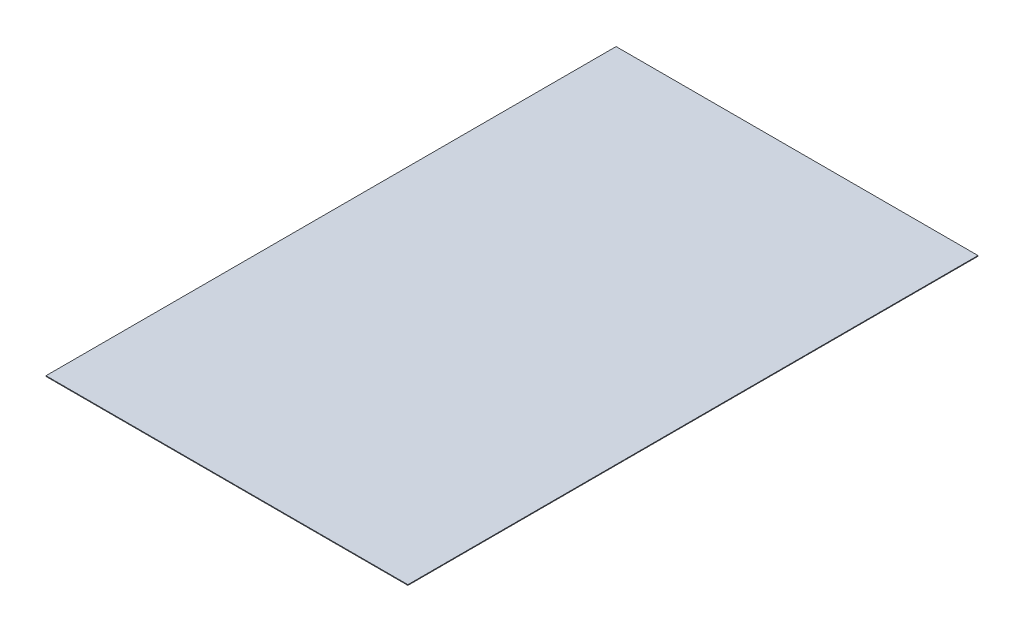
ISO-10303-21;
HEADER;
FILE_DESCRIPTION(('STEP AP214'),'2;1');
FILE_NAME('part.step','',(''),(''),'','','');
FILE_SCHEMA(('AUTOMOTIVE_DESIGN { 1 0 10303 214 1 1 1 1 }'));
ENDSEC;
DATA;
#1=APPLICATION_CONTEXT('core data for automotive mechanical design processes');
#2=APPLICATION_PROTOCOL_DEFINITION('international standard','automotive_design',2000,#1);
#3=PRODUCT_CONTEXT('',#1,'mechanical');
#4=PRODUCT('Part','Part','',(#3));
#5=PRODUCT_RELATED_PRODUCT_CATEGORY('part','',(#4));
#6=PRODUCT_DEFINITION_FORMATION('','',#4);
#7=PRODUCT_DEFINITION_CONTEXT('part definition',#1,'design');
#8=PRODUCT_DEFINITION('design','',#6,#7);
#9=PRODUCT_DEFINITION_SHAPE('','',#8);
#10=(LENGTH_UNIT() NAMED_UNIT(*) SI_UNIT(.MILLI.,.METRE.));
#11=(NAMED_UNIT(*) PLANE_ANGLE_UNIT() SI_UNIT($,.RADIAN.));
#12=(NAMED_UNIT(*) SI_UNIT($,.STERADIAN.) SOLID_ANGLE_UNIT());
#13=UNCERTAINTY_MEASURE_WITH_UNIT(LENGTH_MEASURE(1.E-05),#10,'distance_accuracy_value','');
#14=(GEOMETRIC_REPRESENTATION_CONTEXT(3) GLOBAL_UNCERTAINTY_ASSIGNED_CONTEXT((#13)) GLOBAL_UNIT_ASSIGNED_CONTEXT((#10,
#11,#12)) REPRESENTATION_CONTEXT('',''));
#15=CARTESIAN_POINT('',(0.,0.,0.));
#16=DIRECTION('',(0.,0.,1.));
#17=DIRECTION('',(1.,0.,0.));
#18=AXIS2_PLACEMENT_3D('',#15,#16,#17);
#19=CARTESIAN_POINT('',(0.,10.,0.));
#20=DIRECTION('',(1.,0.,0.));
#21=DIRECTION('',(0.,0.,-1.));
#22=AXIS2_PLACEMENT_3D('',#19,#20,#21);
#23=PLANE('',#22);
#24=DIRECTION('',(0.,0.,1.));
#25=VECTOR('',#24,1.);
#26=CARTESIAN_POINT('',(0.,0.,0.));
#27=LINE('',#26,#25);
#28=CARTESIAN_POINT('',(0.,0.,0.));
#29=VERTEX_POINT('',#28);
#30=CARTESIAN_POINT('',(1.02625401768548E-12,0.,8380.));
#31=VERTEX_POINT('',#30);
#32=EDGE_CURVE('E99',#29,#31,#27,.T.);
#33=ORIENTED_EDGE('',*,*,#32,.T.);
#34=DIRECTION('',(0.,-1.,0.));
#35=VECTOR('',#34,1.);
#36=CARTESIAN_POINT('',(1.02625401768548E-12,10.,8380.));
#37=LINE('',#36,#35);
#38=CARTESIAN_POINT('',(1.02625401768548E-12,10.,8380.));
#39=VERTEX_POINT('',#38);
#40=EDGE_CURVE('E11',#39,#31,#37,.T.);
#41=ORIENTED_EDGE('',*,*,#40,.F.);
#42=DIRECTION('',(0.,0.,1.));
#43=VECTOR('',#42,1.);
#44=CARTESIAN_POINT('',(0.,10.,0.));
#45=LINE('',#44,#43);
#46=CARTESIAN_POINT('',(0.,10.,0.));
#47=VERTEX_POINT('',#46);
#48=EDGE_CURVE('E87',#47,#39,#45,.T.);
#49=ORIENTED_EDGE('',*,*,#48,.F.);
#50=DIRECTION('',(0.,-1.,0.));
#51=VECTOR('',#50,1.);
#52=CARTESIAN_POINT('',(0.,10.,0.));
#53=LINE('',#52,#51);
#54=EDGE_CURVE('E95',#47,#29,#53,.T.);
#55=ORIENTED_EDGE('',*,*,#54,.T.);
#56=EDGE_LOOP('',(#33,#41,#49,#55));
#57=FACE_BOUND('',#56,.T.);
#58=ADVANCED_FACE('F36',(#57),#23,.F.);
#59=CARTESIAN_POINT('',(1.02625401768548E-12,10.,8380.));
#60=DIRECTION('',(0.,0.,-1.));
#61=DIRECTION('',(-1.,0.,0.));
#62=AXIS2_PLACEMENT_3D('',#59,#60,#61);
#63=PLANE('',#62);
#64=DIRECTION('',(1.,0.,0.));
#65=VECTOR('',#64,1.);
#66=CARTESIAN_POINT('',(1.02625401768548E-12,0.,8380.));
#67=LINE('',#66,#65);
#68=CARTESIAN_POINT('',(5320.,0.,8380.));
#69=VERTEX_POINT('',#68);
#70=EDGE_CURVE('E91',#31,#69,#67,.T.);
#71=ORIENTED_EDGE('',*,*,#70,.T.);
#72=DIRECTION('',(0.,-1.,0.));
#73=VECTOR('',#72,1.);
#74=CARTESIAN_POINT('',(5320.,10.,8380.));
#75=LINE('',#74,#73);
#76=CARTESIAN_POINT('',(5320.,10.,8380.));
#77=VERTEX_POINT('',#76);
#78=EDGE_CURVE('E44',#77,#69,#75,.T.);
#79=ORIENTED_EDGE('',*,*,#78,.F.);
#80=DIRECTION('',(1.,0.,0.));
#81=VECTOR('',#80,1.);
#82=CARTESIAN_POINT('',(1.02625401768548E-12,10.,8380.));
#83=LINE('',#82,#81);
#84=EDGE_CURVE('E82',#39,#77,#83,.T.);
#85=ORIENTED_EDGE('',*,*,#84,.F.);
#86=ORIENTED_EDGE('',*,*,#40,.T.);
#87=EDGE_LOOP('',(#71,#79,#85,#86));
#88=FACE_BOUND('',#87,.T.);
#89=ADVANCED_FACE('F90',(#88),#63,.F.);
#90=CARTESIAN_POINT('',(5320.,10.,0.));
#91=DIRECTION('',(-1.,0.,0.));
#92=DIRECTION('',(0.,0.,1.));
#93=AXIS2_PLACEMENT_3D('',#90,#91,#92);
#94=PLANE('',#93);
#95=DIRECTION('',(0.,0.,-1.));
#96=VECTOR('',#95,1.);
#97=CARTESIAN_POINT('',(5320.,0.,0.));
#98=LINE('',#97,#96);
#99=CARTESIAN_POINT('',(5320.,0.,0.));
#100=VERTEX_POINT('',#99);
#101=EDGE_CURVE('E69',#69,#100,#98,.T.);
#102=ORIENTED_EDGE('',*,*,#101,.T.);
#103=DIRECTION('',(0.,-1.,0.));
#104=VECTOR('',#103,1.);
#105=CARTESIAN_POINT('',(5320.,10.,0.));
#106=LINE('',#105,#104);
#107=CARTESIAN_POINT('',(5320.,10.,0.));
#108=VERTEX_POINT('',#107);
#109=EDGE_CURVE('E92',#108,#100,#106,.T.);
#110=ORIENTED_EDGE('',*,*,#109,.F.);
#111=DIRECTION('',(0.,0.,-1.));
#112=VECTOR('',#111,1.);
#113=CARTESIAN_POINT('',(5320.,10.,0.));
#114=LINE('',#113,#112);
#115=EDGE_CURVE('E85',#77,#108,#114,.T.);
#116=ORIENTED_EDGE('',*,*,#115,.F.);
#117=ORIENTED_EDGE('',*,*,#78,.T.);
#118=EDGE_LOOP('',(#102,#110,#116,#117));
#119=FACE_BOUND('',#118,.T.);
#120=ADVANCED_FACE('F93',(#119),#94,.F.);
#121=CARTESIAN_POINT('',(0.,10.,0.));
#122=DIRECTION('',(0.,0.,1.));
#123=DIRECTION('',(1.,0.,0.));
#124=AXIS2_PLACEMENT_3D('',#121,#122,#123);
#125=PLANE('',#124);
#126=DIRECTION('',(-1.,0.,0.));
#127=VECTOR('',#126,1.);
#128=CARTESIAN_POINT('',(0.,0.,0.));
#129=LINE('',#128,#127);
#130=EDGE_CURVE('E75',#100,#29,#129,.T.);
#131=ORIENTED_EDGE('',*,*,#130,.T.);
#132=ORIENTED_EDGE('',*,*,#54,.F.);
#133=DIRECTION('',(-1.,0.,0.));
#134=VECTOR('',#133,1.);
#135=CARTESIAN_POINT('',(0.,10.,0.));
#136=LINE('',#135,#134);
#137=EDGE_CURVE('E52',#108,#47,#136,.T.);
#138=ORIENTED_EDGE('',*,*,#137,.F.);
#139=ORIENTED_EDGE('',*,*,#109,.T.);
#140=EDGE_LOOP('',(#131,#132,#138,#139));
#141=FACE_BOUND('',#140,.T.);
#142=ADVANCED_FACE('F106',(#141),#125,.F.);
#143=CARTESIAN_POINT('',(0.,10.,0.));
#144=DIRECTION('',(0.,1.,0.));
#145=DIRECTION('',(0.,0.,1.));
#146=AXIS2_PLACEMENT_3D('',#143,#144,#145);
#147=PLANE('',#146);
#148=ORIENTED_EDGE('',*,*,#48,.T.);
#149=ORIENTED_EDGE('',*,*,#84,.T.);
#150=ORIENTED_EDGE('',*,*,#115,.T.);
#151=ORIENTED_EDGE('',*,*,#137,.T.);
#152=EDGE_LOOP('',(#148,#149,#150,#151));
#153=FACE_BOUND('',#152,.T.);
#154=ADVANCED_FACE('F83',(#153),#147,.T.);
#155=CARTESIAN_POINT('',(0.,0.,0.));
#156=DIRECTION('',(0.,1.,0.));
#157=DIRECTION('',(0.,0.,1.));
#158=AXIS2_PLACEMENT_3D('',#155,#156,#157);
#159=PLANE('',#158);
#160=ORIENTED_EDGE('',*,*,#32,.F.);
#161=ORIENTED_EDGE('',*,*,#130,.F.);
#162=ORIENTED_EDGE('',*,*,#101,.F.);
#163=ORIENTED_EDGE('',*,*,#70,.F.);
#164=EDGE_LOOP('',(#160,#161,#162,#163));
#165=FACE_BOUND('',#164,.T.);
#166=ADVANCED_FACE('F109',(#165),#159,.F.);
#167=CLOSED_SHELL('',(#58,#89,#120,#142,#154,#166));
#168=MANIFOLD_SOLID_BREP('B2',#167);
#169=ADVANCED_BREP_SHAPE_REPRESENTATION('',(#18,#168),#14);
#170=SHAPE_DEFINITION_REPRESENTATION(#9,#169);
ENDSEC;
END-ISO-10303-21;
